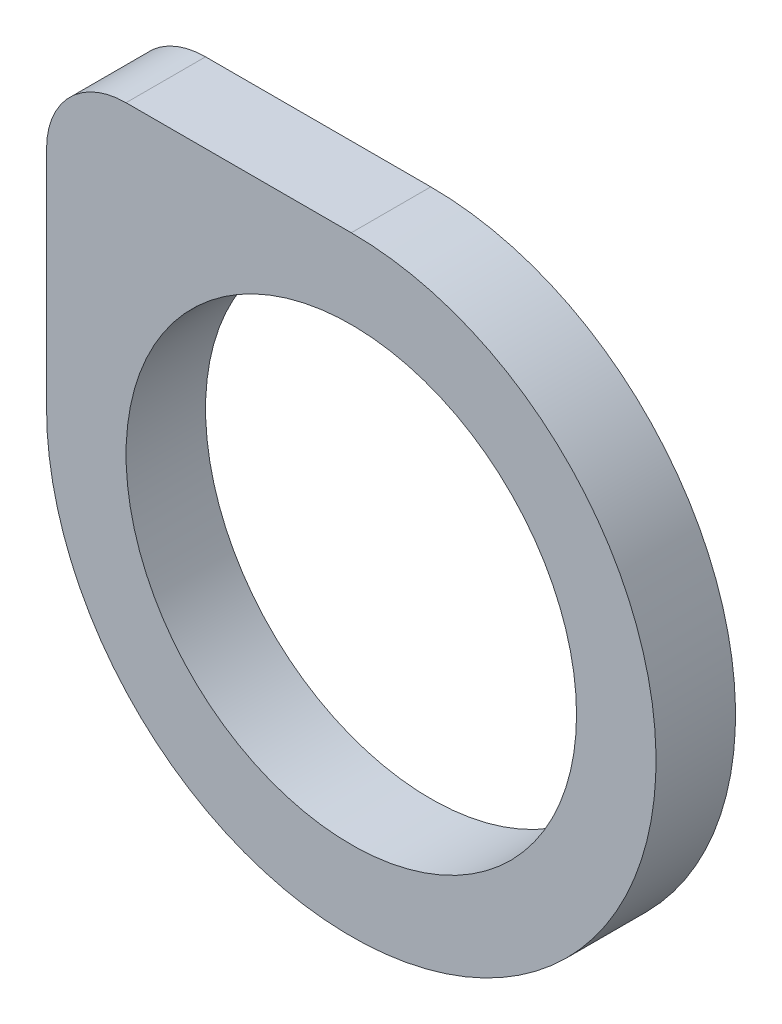
ISO-10303-21;
HEADER;
FILE_DESCRIPTION(('STEP AP214'),'2;1');
FILE_NAME('part.step','',(''),(''),'','','');
FILE_SCHEMA(('AUTOMOTIVE_DESIGN { 1 0 10303 214 1 1 1 1 }'));
ENDSEC;
DATA;
#1=APPLICATION_CONTEXT('core data for automotive mechanical design processes');
#2=APPLICATION_PROTOCOL_DEFINITION('international standard','automotive_design',2000,#1);
#3=PRODUCT_CONTEXT('',#1,'mechanical');
#4=PRODUCT('Part','Part','',(#3));
#5=PRODUCT_RELATED_PRODUCT_CATEGORY('part','',(#4));
#6=PRODUCT_DEFINITION_FORMATION('','',#4);
#7=PRODUCT_DEFINITION_CONTEXT('part definition',#1,'design');
#8=PRODUCT_DEFINITION('design','',#6,#7);
#9=PRODUCT_DEFINITION_SHAPE('','',#8);
#10=(LENGTH_UNIT() NAMED_UNIT(*) SI_UNIT(.MILLI.,.METRE.));
#11=(NAMED_UNIT(*) PLANE_ANGLE_UNIT() SI_UNIT($,.RADIAN.));
#12=(NAMED_UNIT(*) SI_UNIT($,.STERADIAN.) SOLID_ANGLE_UNIT());
#13=UNCERTAINTY_MEASURE_WITH_UNIT(LENGTH_MEASURE(1.E-05),#10,'distance_accuracy_value','');
#14=(GEOMETRIC_REPRESENTATION_CONTEXT(3) GLOBAL_UNCERTAINTY_ASSIGNED_CONTEXT((#13)) GLOBAL_UNIT_ASSIGNED_CONTEXT((#10,
#11,#12)) REPRESENTATION_CONTEXT('',''));
#15=CARTESIAN_POINT('',(0.,0.,0.));
#16=DIRECTION('',(0.,0.,1.));
#17=DIRECTION('',(1.,0.,0.));
#18=AXIS2_PLACEMENT_3D('',#15,#16,#17);
#19=CARTESIAN_POINT('',(0.,0.,3.));
#20=DIRECTION('',(0.,0.,1.));
#21=DIRECTION('',(1.,0.,0.));
#22=AXIS2_PLACEMENT_3D('',#19,#20,#21);
#23=PLANE('',#22);
#24=CARTESIAN_POINT('',(0.,0.,3.));
#25=DIRECTION('',(0.,0.,1.));
#26=DIRECTION('',(1.,0.,0.));
#27=AXIS2_PLACEMENT_3D('',#24,#25,#26);
#28=CIRCLE('',#27,11.5);
#29=CARTESIAN_POINT('',(-11.5,0.,3.));
#30=VERTEX_POINT('',#29);
#31=CARTESIAN_POINT('',(0.,11.5,3.));
#32=VERTEX_POINT('',#31);
#33=EDGE_CURVE('E83',#30,#32,#28,.T.);
#34=ORIENTED_EDGE('',*,*,#33,.T.);
#35=DIRECTION('',(-1.,0.,0.));
#36=VECTOR('',#35,1.);
#37=CARTESIAN_POINT('',(-8.49999999999998,11.5,3.));
#38=LINE('',#37,#36);
#39=CARTESIAN_POINT('',(-8.49999999999998,11.5,3.));
#40=VERTEX_POINT('',#39);
#41=EDGE_CURVE('E78',#32,#40,#38,.T.);
#42=ORIENTED_EDGE('',*,*,#41,.T.);
#43=CARTESIAN_POINT('',(-8.5,8.5,3.));
#44=DIRECTION('',(0.,0.,1.));
#45=DIRECTION('',(-1.,0.,0.));
#46=AXIS2_PLACEMENT_3D('',#43,#44,#45);
#47=CIRCLE('',#46,3.);
#48=CARTESIAN_POINT('',(-11.5,8.49999999999998,3.));
#49=VERTEX_POINT('',#48);
#50=EDGE_CURVE('E81',#40,#49,#47,.T.);
#51=ORIENTED_EDGE('',*,*,#50,.T.);
#52=DIRECTION('',(0.,-1.,0.));
#53=VECTOR('',#52,1.);
#54=CARTESIAN_POINT('',(-11.5,0.,3.));
#55=LINE('',#54,#53);
#56=EDGE_CURVE('E48',#49,#30,#55,.T.);
#57=ORIENTED_EDGE('',*,*,#56,.T.);
#58=EDGE_LOOP('',(#34,#42,#51,#57));
#59=FACE_BOUND('',#58,.T.);
#60=CARTESIAN_POINT('',(0.,0.,3.));
#61=DIRECTION('',(0.,0.,1.));
#62=DIRECTION('',(1.,0.,0.));
#63=AXIS2_PLACEMENT_3D('',#60,#61,#62);
#64=CIRCLE('',#63,8.5);
#65=CARTESIAN_POINT('',(8.5,0.,3.));
#66=VERTEX_POINT('',#65);
#67=EDGE_CURVE('E98',#66,#66,#64,.T.);
#68=ORIENTED_EDGE('',*,*,#67,.F.);
#69=EDGE_LOOP('',(#68));
#70=FACE_BOUND('',#69,.T.);
#71=ADVANCED_FACE('F31',(#59,#70),#23,.T.);
#72=CARTESIAN_POINT('',(0.,0.,0.));
#73=DIRECTION('',(0.,0.,1.));
#74=DIRECTION('',(1.,0.,0.));
#75=AXIS2_PLACEMENT_3D('',#72,#73,#74);
#76=PLANE('',#75);
#77=CARTESIAN_POINT('',(0.,0.,0.));
#78=DIRECTION('',(0.,0.,1.));
#79=DIRECTION('',(1.,0.,0.));
#80=AXIS2_PLACEMENT_3D('',#77,#78,#79);
#81=CIRCLE('',#80,11.5);
#82=CARTESIAN_POINT('',(-11.5,0.,0.));
#83=VERTEX_POINT('',#82);
#84=CARTESIAN_POINT('',(0.,11.5,0.));
#85=VERTEX_POINT('',#84);
#86=EDGE_CURVE('E95',#83,#85,#81,.T.);
#87=ORIENTED_EDGE('',*,*,#86,.F.);
#88=DIRECTION('',(0.,-1.,0.));
#89=VECTOR('',#88,1.);
#90=CARTESIAN_POINT('',(-11.5,0.,0.));
#91=LINE('',#90,#89);
#92=CARTESIAN_POINT('',(-11.5,8.49999999999998,0.));
#93=VERTEX_POINT('',#92);
#94=EDGE_CURVE('E71',#93,#83,#91,.T.);
#95=ORIENTED_EDGE('',*,*,#94,.F.);
#96=CARTESIAN_POINT('',(-8.5,8.5,0.));
#97=DIRECTION('',(0.,0.,1.));
#98=DIRECTION('',(-1.,0.,0.));
#99=AXIS2_PLACEMENT_3D('',#96,#97,#98);
#100=CIRCLE('',#99,3.);
#101=CARTESIAN_POINT('',(-8.49999999999998,11.5,0.));
#102=VERTEX_POINT('',#101);
#103=EDGE_CURVE('E65',#102,#93,#100,.T.);
#104=ORIENTED_EDGE('',*,*,#103,.F.);
#105=DIRECTION('',(-1.,0.,0.));
#106=VECTOR('',#105,1.);
#107=CARTESIAN_POINT('',(-8.49999999999998,11.5,0.));
#108=LINE('',#107,#106);
#109=EDGE_CURVE('E87',#85,#102,#108,.T.);
#110=ORIENTED_EDGE('',*,*,#109,.F.);
#111=EDGE_LOOP('',(#87,#95,#104,#110));
#112=FACE_BOUND('',#111,.T.);
#113=CARTESIAN_POINT('',(0.,0.,0.));
#114=DIRECTION('',(0.,0.,1.));
#115=DIRECTION('',(1.,0.,0.));
#116=AXIS2_PLACEMENT_3D('',#113,#114,#115);
#117=CIRCLE('',#116,8.5);
#118=CARTESIAN_POINT('',(8.5,0.,0.));
#119=VERTEX_POINT('',#118);
#120=EDGE_CURVE('E110',#119,#119,#117,.T.);
#121=ORIENTED_EDGE('',*,*,#120,.T.);
#122=EDGE_LOOP('',(#121));
#123=FACE_BOUND('',#122,.T.);
#124=ADVANCED_FACE('F106',(#112,#123),#76,.F.);
#125=CARTESIAN_POINT('',(0.,0.,3.));
#126=DIRECTION('',(0.,0.,-1.));
#127=DIRECTION('',(-1.,0.,0.));
#128=AXIS2_PLACEMENT_3D('',#125,#126,#127);
#129=CYLINDRICAL_SURFACE('',#128,11.5);
#130=ORIENTED_EDGE('',*,*,#86,.T.);
#131=DIRECTION('',(0.,0.,-1.));
#132=VECTOR('',#131,1.);
#133=CARTESIAN_POINT('',(0.,11.5,3.));
#134=LINE('',#133,#132);
#135=EDGE_CURVE('E11',#32,#85,#134,.T.);
#136=ORIENTED_EDGE('',*,*,#135,.F.);
#137=ORIENTED_EDGE('',*,*,#33,.F.);
#138=DIRECTION('',(0.,0.,-1.));
#139=VECTOR('',#138,1.);
#140=CARTESIAN_POINT('',(-11.5,0.,3.));
#141=LINE('',#140,#139);
#142=EDGE_CURVE('E91',#30,#83,#141,.T.);
#143=ORIENTED_EDGE('',*,*,#142,.T.);
#144=EDGE_LOOP('',(#130,#136,#137,#143));
#145=FACE_BOUND('',#144,.T.);
#146=ADVANCED_FACE('F33',(#145),#129,.T.);
#147=CARTESIAN_POINT('',(-8.49999999999998,11.5,3.));
#148=DIRECTION('',(0.,-1.,0.));
#149=DIRECTION('',(1.,0.,0.));
#150=AXIS2_PLACEMENT_3D('',#147,#148,#149);
#151=PLANE('',#150);
#152=ORIENTED_EDGE('',*,*,#109,.T.);
#153=DIRECTION('',(0.,0.,-1.));
#154=VECTOR('',#153,1.);
#155=CARTESIAN_POINT('',(-8.49999999999998,11.5,3.));
#156=LINE('',#155,#154);
#157=EDGE_CURVE('E40',#40,#102,#156,.T.);
#158=ORIENTED_EDGE('',*,*,#157,.F.);
#159=ORIENTED_EDGE('',*,*,#41,.F.);
#160=ORIENTED_EDGE('',*,*,#135,.T.);
#161=EDGE_LOOP('',(#152,#158,#159,#160));
#162=FACE_BOUND('',#161,.T.);
#163=ADVANCED_FACE('F86',(#162),#151,.F.);
#164=CARTESIAN_POINT('',(-8.5,8.5,3.));
#165=DIRECTION('',(0.,0.,-1.));
#166=DIRECTION('',(-1.,0.,0.));
#167=AXIS2_PLACEMENT_3D('',#164,#165,#166);
#168=CYLINDRICAL_SURFACE('',#167,3.);
#169=ORIENTED_EDGE('',*,*,#103,.T.);
#170=DIRECTION('',(0.,0.,-1.));
#171=VECTOR('',#170,1.);
#172=CARTESIAN_POINT('',(-11.5,8.49999999999998,3.));
#173=LINE('',#172,#171);
#174=EDGE_CURVE('E88',#49,#93,#173,.T.);
#175=ORIENTED_EDGE('',*,*,#174,.F.);
#176=ORIENTED_EDGE('',*,*,#50,.F.);
#177=ORIENTED_EDGE('',*,*,#157,.T.);
#178=EDGE_LOOP('',(#169,#175,#176,#177));
#179=FACE_BOUND('',#178,.T.);
#180=ADVANCED_FACE('F89',(#179),#168,.T.);
#181=CARTESIAN_POINT('',(-11.5,0.,3.));
#182=DIRECTION('',(1.,0.,0.));
#183=DIRECTION('',(0.,0.,-1.));
#184=AXIS2_PLACEMENT_3D('',#181,#182,#183);
#185=PLANE('',#184);
#186=ORIENTED_EDGE('',*,*,#94,.T.);
#187=ORIENTED_EDGE('',*,*,#142,.F.);
#188=ORIENTED_EDGE('',*,*,#56,.F.);
#189=ORIENTED_EDGE('',*,*,#174,.T.);
#190=EDGE_LOOP('',(#186,#187,#188,#189));
#191=FACE_BOUND('',#190,.T.);
#192=ADVANCED_FACE('F103',(#191),#185,.F.);
#193=CARTESIAN_POINT('',(0.,0.,3.));
#194=DIRECTION('',(0.,0.,-1.));
#195=DIRECTION('',(-1.,0.,0.));
#196=AXIS2_PLACEMENT_3D('',#193,#194,#195);
#197=CYLINDRICAL_SURFACE('',#196,8.5);
#198=ORIENTED_EDGE('',*,*,#67,.T.);
#199=EDGE_LOOP('',(#198));
#200=FACE_BOUND('',#199,.T.);
#201=ORIENTED_EDGE('',*,*,#120,.F.);
#202=EDGE_LOOP('',(#201));
#203=FACE_BOUND('',#202,.T.);
#204=ADVANCED_FACE('F116',(#200,#203),#197,.F.);
#205=CLOSED_SHELL('',(#71,#124,#146,#163,#180,#192,#204));
#206=MANIFOLD_SOLID_BREP('B2',#205);
#207=ADVANCED_BREP_SHAPE_REPRESENTATION('',(#18,#206),#14);
#208=SHAPE_DEFINITION_REPRESENTATION(#9,#207);
ENDSEC;
END-ISO-10303-21;
